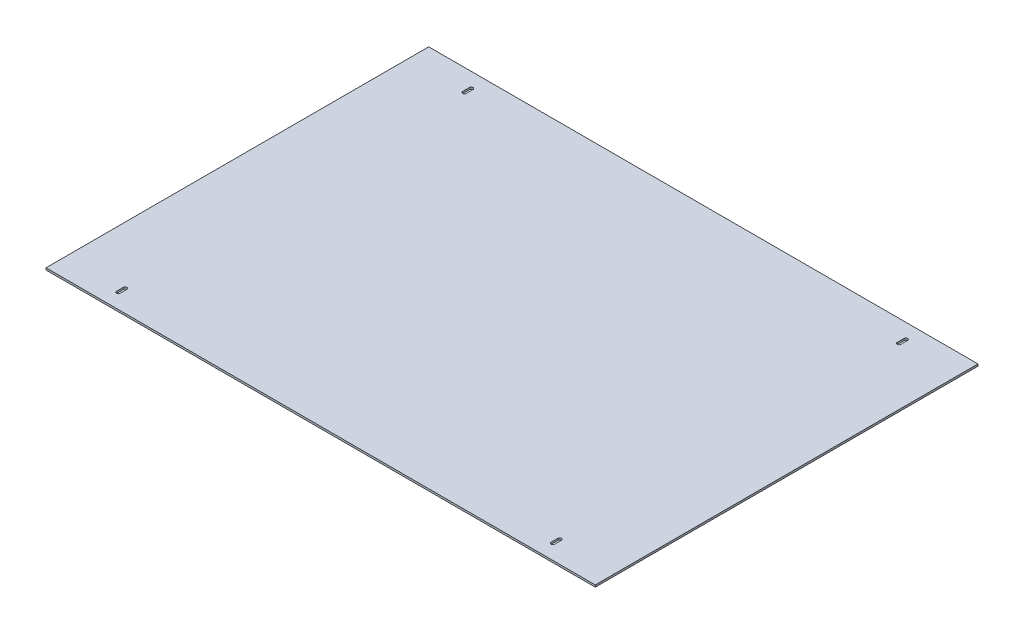
ISO-10303-21;
HEADER;
FILE_DESCRIPTION(('STEP AP214'),'2;1');
FILE_NAME('part.step','',(''),(''),'','','');
FILE_SCHEMA(('AUTOMOTIVE_DESIGN { 1 0 10303 214 1 1 1 1 }'));
ENDSEC;
DATA;
#1=APPLICATION_CONTEXT('core data for automotive mechanical design processes');
#2=APPLICATION_PROTOCOL_DEFINITION('international standard','automotive_design',2000,#1);
#3=PRODUCT_CONTEXT('',#1,'mechanical');
#4=PRODUCT('Part','Part','',(#3));
#5=PRODUCT_RELATED_PRODUCT_CATEGORY('part','',(#4));
#6=PRODUCT_DEFINITION_FORMATION('','',#4);
#7=PRODUCT_DEFINITION_CONTEXT('part definition',#1,'design');
#8=PRODUCT_DEFINITION('design','',#6,#7);
#9=PRODUCT_DEFINITION_SHAPE('','',#8);
#10=(LENGTH_UNIT() NAMED_UNIT(*) SI_UNIT(.MILLI.,.METRE.));
#11=(NAMED_UNIT(*) PLANE_ANGLE_UNIT() SI_UNIT($,.RADIAN.));
#12=(NAMED_UNIT(*) SI_UNIT($,.STERADIAN.) SOLID_ANGLE_UNIT());
#13=UNCERTAINTY_MEASURE_WITH_UNIT(LENGTH_MEASURE(1.E-05),#10,'distance_accuracy_value','');
#14=(GEOMETRIC_REPRESENTATION_CONTEXT(3) GLOBAL_UNCERTAINTY_ASSIGNED_CONTEXT((#13)) GLOBAL_UNIT_ASSIGNED_CONTEXT((#10,
#11,#12)) REPRESENTATION_CONTEXT('',''));
#15=CARTESIAN_POINT('',(0.,0.,0.));
#16=DIRECTION('',(0.,0.,1.));
#17=DIRECTION('',(1.,0.,0.));
#18=AXIS2_PLACEMENT_3D('',#15,#16,#17);
#19=CARTESIAN_POINT('',(353.1235,2.54,246.0625));
#20=DIRECTION('',(-1.,0.,0.));
#21=DIRECTION('',(0.,0.,1.));
#22=AXIS2_PLACEMENT_3D('',#19,#20,#21);
#23=PLANE('',#22);
#24=DIRECTION('',(0.,0.,-1.));
#25=VECTOR('',#24,1.);
#26=CARTESIAN_POINT('',(353.1235,0.,246.0625));
#27=LINE('',#26,#25);
#28=CARTESIAN_POINT('',(353.1235,0.,246.0625));
#29=VERTEX_POINT('',#28);
#30=CARTESIAN_POINT('',(353.1235,0.,-246.0625));
#31=VERTEX_POINT('',#30);
#32=EDGE_CURVE('E295',#29,#31,#27,.T.);
#33=ORIENTED_EDGE('',*,*,#32,.T.);
#34=DIRECTION('',(0.,-1.,0.));
#35=VECTOR('',#34,1.);
#36=CARTESIAN_POINT('',(353.1235,2.54,-246.0625));
#37=LINE('',#36,#35);
#38=CARTESIAN_POINT('',(353.1235,2.54,-246.0625));
#39=VERTEX_POINT('',#38);
#40=EDGE_CURVE('E11',#39,#31,#37,.T.);
#41=ORIENTED_EDGE('',*,*,#40,.F.);
#42=DIRECTION('',(0.,0.,-1.));
#43=VECTOR('',#42,1.);
#44=CARTESIAN_POINT('',(353.1235,2.54,246.0625));
#45=LINE('',#44,#43);
#46=CARTESIAN_POINT('',(353.1235,2.54,246.0625));
#47=VERTEX_POINT('',#46);
#48=EDGE_CURVE('E302',#47,#39,#45,.T.);
#49=ORIENTED_EDGE('',*,*,#48,.F.);
#50=DIRECTION('',(0.,-1.,0.));
#51=VECTOR('',#50,1.);
#52=CARTESIAN_POINT('',(353.1235,2.54,246.0625));
#53=LINE('',#52,#51);
#54=EDGE_CURVE('E312',#47,#29,#53,.T.);
#55=ORIENTED_EDGE('',*,*,#54,.T.);
#56=EDGE_LOOP('',(#33,#41,#49,#55));
#57=FACE_BOUND('',#56,.T.);
#58=ADVANCED_FACE('F33',(#57),#23,.F.);
#59=CARTESIAN_POINT('',(-353.1235,2.54,-246.0625));
#60=DIRECTION('',(0.,0.,1.));
#61=DIRECTION('',(1.,0.,0.));
#62=AXIS2_PLACEMENT_3D('',#59,#60,#61);
#63=PLANE('',#62);
#64=DIRECTION('',(-1.,0.,0.));
#65=VECTOR('',#64,1.);
#66=CARTESIAN_POINT('',(-353.1235,0.,-246.0625));
#67=LINE('',#66,#65);
#68=CARTESIAN_POINT('',(-353.1235,0.,-246.0625));
#69=VERTEX_POINT('',#68);
#70=EDGE_CURVE('E315',#31,#69,#67,.T.);
#71=ORIENTED_EDGE('',*,*,#70,.T.);
#72=DIRECTION('',(0.,-1.,0.));
#73=VECTOR('',#72,1.);
#74=CARTESIAN_POINT('',(-353.1235,2.54,-246.0625));
#75=LINE('',#74,#73);
#76=CARTESIAN_POINT('',(-353.1235,2.54,-246.0625));
#77=VERTEX_POINT('',#76);
#78=EDGE_CURVE('E40',#77,#69,#75,.T.);
#79=ORIENTED_EDGE('',*,*,#78,.F.);
#80=DIRECTION('',(-1.,0.,0.));
#81=VECTOR('',#80,1.);
#82=CARTESIAN_POINT('',(-353.1235,2.54,-246.0625));
#83=LINE('',#82,#81);
#84=EDGE_CURVE('E305',#39,#77,#83,.T.);
#85=ORIENTED_EDGE('',*,*,#84,.F.);
#86=ORIENTED_EDGE('',*,*,#40,.T.);
#87=EDGE_LOOP('',(#71,#79,#85,#86));
#88=FACE_BOUND('',#87,.T.);
#89=ADVANCED_FACE('F344',(#88),#63,.F.);
#90=CARTESIAN_POINT('',(-353.1235,2.54,246.0625));
#91=DIRECTION('',(1.,0.,0.));
#92=DIRECTION('',(0.,0.,-1.));
#93=AXIS2_PLACEMENT_3D('',#90,#91,#92);
#94=PLANE('',#93);
#95=DIRECTION('',(0.,0.,1.));
#96=VECTOR('',#95,1.);
#97=CARTESIAN_POINT('',(-353.1235,0.,246.0625));
#98=LINE('',#97,#96);
#99=CARTESIAN_POINT('',(-353.1235,0.,246.0625));
#100=VERTEX_POINT('',#99);
#101=EDGE_CURVE('E317',#69,#100,#98,.T.);
#102=ORIENTED_EDGE('',*,*,#101,.T.);
#103=DIRECTION('',(0.,-1.,0.));
#104=VECTOR('',#103,1.);
#105=CARTESIAN_POINT('',(-353.1235,2.54,246.0625));
#106=LINE('',#105,#104);
#107=CARTESIAN_POINT('',(-353.1235,2.54,246.0625));
#108=VERTEX_POINT('',#107);
#109=EDGE_CURVE('E322',#108,#100,#106,.T.);
#110=ORIENTED_EDGE('',*,*,#109,.F.);
#111=DIRECTION('',(0.,0.,1.));
#112=VECTOR('',#111,1.);
#113=CARTESIAN_POINT('',(-353.1235,2.54,246.0625));
#114=LINE('',#113,#112);
#115=EDGE_CURVE('E308',#77,#108,#114,.T.);
#116=ORIENTED_EDGE('',*,*,#115,.F.);
#117=ORIENTED_EDGE('',*,*,#78,.T.);
#118=EDGE_LOOP('',(#102,#110,#116,#117));
#119=FACE_BOUND('',#118,.T.);
#120=ADVANCED_FACE('F329',(#119),#94,.F.);
#121=CARTESIAN_POINT('',(-353.1235,2.54,246.0625));
#122=DIRECTION('',(0.,0.,-1.));
#123=DIRECTION('',(-1.,0.,0.));
#124=AXIS2_PLACEMENT_3D('',#121,#122,#123);
#125=PLANE('',#124);
#126=DIRECTION('',(1.,0.,0.));
#127=VECTOR('',#126,1.);
#128=CARTESIAN_POINT('',(-353.1235,0.,246.0625));
#129=LINE('',#128,#127);
#130=EDGE_CURVE('E306',#100,#29,#129,.T.);
#131=ORIENTED_EDGE('',*,*,#130,.T.);
#132=ORIENTED_EDGE('',*,*,#54,.F.);
#133=DIRECTION('',(1.,0.,0.));
#134=VECTOR('',#133,1.);
#135=CARTESIAN_POINT('',(-353.1235,2.54,246.0625));
#136=LINE('',#135,#134);
#137=EDGE_CURVE('E310',#108,#47,#136,.T.);
#138=ORIENTED_EDGE('',*,*,#137,.F.);
#139=ORIENTED_EDGE('',*,*,#109,.T.);
#140=EDGE_LOOP('',(#131,#132,#138,#139));
#141=FACE_BOUND('',#140,.T.);
#142=ADVANCED_FACE('F337',(#141),#125,.F.);
#143=CARTESIAN_POINT('',(0.,2.54,0.));
#144=DIRECTION('',(0.,-1.,0.));
#145=DIRECTION('',(0.,0.,-1.));
#146=AXIS2_PLACEMENT_3D('',#143,#144,#145);
#147=PLANE('',#146);
#148=DIRECTION('',(0.,0.,1.));
#149=VECTOR('',#148,1.);
#150=CARTESIAN_POINT('',(-281.6479,2.54,218.1225));
#151=LINE('',#150,#149);
#152=CARTESIAN_POINT('',(-281.6479,2.54,218.1225));
#153=VERTEX_POINT('',#152);
#154=CARTESIAN_POINT('',(-281.6479,2.54,227.0125));
#155=VERTEX_POINT('',#154);
#156=EDGE_CURVE('E196',#153,#155,#151,.T.);
#157=ORIENTED_EDGE('',*,*,#156,.F.);
#158=CARTESIAN_POINT('',(-279.4,2.54,218.1225));
#159=DIRECTION('',(0.,1.,0.));
#160=DIRECTION('',(0.,0.,1.));
#161=AXIS2_PLACEMENT_3D('',#158,#159,#160);
#162=CIRCLE('',#161,2.24789999999997);
#163=CARTESIAN_POINT('',(-277.1521,2.54,218.1225));
#164=VERTEX_POINT('',#163);
#165=EDGE_CURVE('E47',#164,#153,#162,.T.);
#166=ORIENTED_EDGE('',*,*,#165,.F.);
#167=DIRECTION('',(0.,0.,-1.));
#168=VECTOR('',#167,1.);
#169=CARTESIAN_POINT('',(-277.1521,2.54,218.1225));
#170=LINE('',#169,#168);
#171=CARTESIAN_POINT('',(-277.1521,2.54,227.0125));
#172=VERTEX_POINT('',#171);
#173=EDGE_CURVE('E187',#172,#164,#170,.T.);
#174=ORIENTED_EDGE('',*,*,#173,.F.);
#175=CARTESIAN_POINT('',(-279.4,2.54,227.0125));
#176=DIRECTION('',(0.,1.,0.));
#177=DIRECTION('',(0.,0.,1.));
#178=AXIS2_PLACEMENT_3D('',#175,#176,#177);
#179=CIRCLE('',#178,2.24789999999997);
#180=EDGE_CURVE('E190',#155,#172,#179,.T.);
#181=ORIENTED_EDGE('',*,*,#180,.F.);
#182=EDGE_LOOP('',(#157,#166,#174,#181));
#183=FACE_BOUND('',#182,.T.);
#184=DIRECTION('',(0.,0.,1.));
#185=VECTOR('',#184,1.);
#186=CARTESIAN_POINT('',(277.1521,2.54,218.1225));
#187=LINE('',#186,#185);
#188=CARTESIAN_POINT('',(277.1521,2.54,218.1225));
#189=VERTEX_POINT('',#188);
#190=CARTESIAN_POINT('',(277.1521,2.54,227.0125));
#191=VERTEX_POINT('',#190);
#192=EDGE_CURVE('E221',#189,#191,#187,.T.);
#193=ORIENTED_EDGE('',*,*,#192,.F.);
#194=CARTESIAN_POINT('',(279.4,2.54,218.1225));
#195=DIRECTION('',(0.,1.,0.));
#196=DIRECTION('',(0.,0.,-1.));
#197=AXIS2_PLACEMENT_3D('',#194,#195,#196);
#198=CIRCLE('',#197,2.24789999999997);
#199=CARTESIAN_POINT('',(281.6479,2.54,218.1225));
#200=VERTEX_POINT('',#199);
#201=EDGE_CURVE('E202',#200,#189,#198,.T.);
#202=ORIENTED_EDGE('',*,*,#201,.F.);
#203=DIRECTION('',(0.,0.,-1.));
#204=VECTOR('',#203,1.);
#205=CARTESIAN_POINT('',(281.6479,2.54,218.1225));
#206=LINE('',#205,#204);
#207=CARTESIAN_POINT('',(281.6479,2.54,227.0125));
#208=VERTEX_POINT('',#207);
#209=EDGE_CURVE('E210',#208,#200,#206,.T.);
#210=ORIENTED_EDGE('',*,*,#209,.F.);
#211=CARTESIAN_POINT('',(279.4,2.54,227.0125));
#212=DIRECTION('',(0.,1.,0.));
#213=DIRECTION('',(0.,0.,-1.));
#214=AXIS2_PLACEMENT_3D('',#211,#212,#213);
#215=CIRCLE('',#214,2.24789999999997);
#216=EDGE_CURVE('E224',#191,#208,#215,.T.);
#217=ORIENTED_EDGE('',*,*,#216,.F.);
#218=EDGE_LOOP('',(#193,#202,#210,#217));
#219=FACE_BOUND('',#218,.T.);
#220=DIRECTION('',(0.,0.,-1.));
#221=VECTOR('',#220,1.);
#222=CARTESIAN_POINT('',(-277.1521,2.54,-218.1225));
#223=LINE('',#222,#221);
#224=CARTESIAN_POINT('',(-277.1521,2.54,-218.1225));
#225=VERTEX_POINT('',#224);
#226=CARTESIAN_POINT('',(-277.1521,2.54,-227.0125));
#227=VERTEX_POINT('',#226);
#228=EDGE_CURVE('E253',#225,#227,#223,.T.);
#229=ORIENTED_EDGE('',*,*,#228,.F.);
#230=CARTESIAN_POINT('',(-279.4,2.54,-218.1225));
#231=DIRECTION('',(0.,1.,0.));
#232=DIRECTION('',(0.,0.,-1.));
#233=AXIS2_PLACEMENT_3D('',#230,#231,#232);
#234=CIRCLE('',#233,2.24789999999997);
#235=CARTESIAN_POINT('',(-281.6479,2.54,-218.1225));
#236=VERTEX_POINT('',#235);
#237=EDGE_CURVE('E231',#236,#225,#234,.T.);
#238=ORIENTED_EDGE('',*,*,#237,.F.);
#239=DIRECTION('',(0.,0.,1.));
#240=VECTOR('',#239,1.);
#241=CARTESIAN_POINT('',(-281.6479,2.54,-218.1225));
#242=LINE('',#241,#240);
#243=CARTESIAN_POINT('',(-281.6479,2.54,-227.0125));
#244=VERTEX_POINT('',#243);
#245=EDGE_CURVE('E242',#244,#236,#242,.T.);
#246=ORIENTED_EDGE('',*,*,#245,.F.);
#247=CARTESIAN_POINT('',(-279.4,2.54,-227.0125));
#248=DIRECTION('',(0.,1.,0.));
#249=DIRECTION('',(0.,0.,-1.));
#250=AXIS2_PLACEMENT_3D('',#247,#248,#249);
#251=CIRCLE('',#250,2.24789999999997);
#252=EDGE_CURVE('E256',#227,#244,#251,.T.);
#253=ORIENTED_EDGE('',*,*,#252,.F.);
#254=EDGE_LOOP('',(#229,#238,#246,#253));
#255=FACE_BOUND('',#254,.T.);
#256=DIRECTION('',(0.,0.,-1.));
#257=VECTOR('',#256,1.);
#258=CARTESIAN_POINT('',(281.6479,2.54,-218.1225));
#259=LINE('',#258,#257);
#260=CARTESIAN_POINT('',(281.6479,2.54,-218.1225));
#261=VERTEX_POINT('',#260);
#262=CARTESIAN_POINT('',(281.6479,2.54,-227.0125));
#263=VERTEX_POINT('',#262);
#264=EDGE_CURVE('E285',#261,#263,#259,.T.);
#265=ORIENTED_EDGE('',*,*,#264,.F.);
#266=CARTESIAN_POINT('',(279.4,2.54,-218.1225));
#267=DIRECTION('',(0.,1.,0.));
#268=DIRECTION('',(0.,0.,1.));
#269=AXIS2_PLACEMENT_3D('',#266,#267,#268);
#270=CIRCLE('',#269,2.24789999999997);
#271=CARTESIAN_POINT('',(277.1521,2.54,-218.1225));
#272=VERTEX_POINT('',#271);
#273=EDGE_CURVE('E263',#272,#261,#270,.T.);
#274=ORIENTED_EDGE('',*,*,#273,.F.);
#275=DIRECTION('',(0.,0.,1.));
#276=VECTOR('',#275,1.);
#277=CARTESIAN_POINT('',(277.1521,2.54,-218.1225));
#278=LINE('',#277,#276);
#279=CARTESIAN_POINT('',(277.1521,2.54,-227.0125));
#280=VERTEX_POINT('',#279);
#281=EDGE_CURVE('E274',#280,#272,#278,.T.);
#282=ORIENTED_EDGE('',*,*,#281,.F.);
#283=CARTESIAN_POINT('',(279.4,2.54,-227.0125));
#284=DIRECTION('',(0.,1.,0.));
#285=DIRECTION('',(0.,0.,1.));
#286=AXIS2_PLACEMENT_3D('',#283,#284,#285);
#287=CIRCLE('',#286,2.24789999999997);
#288=EDGE_CURVE('E288',#263,#280,#287,.T.);
#289=ORIENTED_EDGE('',*,*,#288,.F.);
#290=EDGE_LOOP('',(#265,#274,#282,#289));
#291=FACE_BOUND('',#290,.T.);
#292=ORIENTED_EDGE('',*,*,#48,.T.);
#293=ORIENTED_EDGE('',*,*,#84,.T.);
#294=ORIENTED_EDGE('',*,*,#115,.T.);
#295=ORIENTED_EDGE('',*,*,#137,.T.);
#296=EDGE_LOOP('',(#292,#293,#294,#295));
#297=FACE_BOUND('',#296,.T.);
#298=ADVANCED_FACE('F343',(#183,#219,#255,#291,#297),#147,.F.);
#299=CARTESIAN_POINT('',(0.,0.,0.));
#300=DIRECTION('',(0.,-1.,0.));
#301=DIRECTION('',(0.,0.,-1.));
#302=AXIS2_PLACEMENT_3D('',#299,#300,#301);
#303=PLANE('',#302);
#304=CARTESIAN_POINT('',(-279.4,0.,218.1225));
#305=DIRECTION('',(0.,1.,0.));
#306=DIRECTION('',(0.,0.,1.));
#307=AXIS2_PLACEMENT_3D('',#304,#305,#306);
#308=CIRCLE('',#307,2.24789999999997);
#309=CARTESIAN_POINT('',(-277.1521,0.,218.1225));
#310=VERTEX_POINT('',#309);
#311=CARTESIAN_POINT('',(-281.6479,0.,218.1225));
#312=VERTEX_POINT('',#311);
#313=EDGE_CURVE('E171',#310,#312,#308,.T.);
#314=ORIENTED_EDGE('',*,*,#313,.T.);
#315=DIRECTION('',(0.,0.,1.));
#316=VECTOR('',#315,1.);
#317=CARTESIAN_POINT('',(-281.6479,0.,218.1225));
#318=LINE('',#317,#316);
#319=CARTESIAN_POINT('',(-281.6479,0.,227.0125));
#320=VERTEX_POINT('',#319);
#321=EDGE_CURVE('E180',#312,#320,#318,.T.);
#322=ORIENTED_EDGE('',*,*,#321,.T.);
#323=CARTESIAN_POINT('',(-279.4,0.,227.0125));
#324=DIRECTION('',(0.,1.,0.));
#325=DIRECTION('',(0.,0.,1.));
#326=AXIS2_PLACEMENT_3D('',#323,#324,#325);
#327=CIRCLE('',#326,2.24789999999997);
#328=CARTESIAN_POINT('',(-277.1521,0.,227.0125));
#329=VERTEX_POINT('',#328);
#330=EDGE_CURVE('E55',#320,#329,#327,.T.);
#331=ORIENTED_EDGE('',*,*,#330,.T.);
#332=DIRECTION('',(0.,0.,-1.));
#333=VECTOR('',#332,1.);
#334=CARTESIAN_POINT('',(-277.1521,0.,218.1225));
#335=LINE('',#334,#333);
#336=EDGE_CURVE('E177',#329,#310,#335,.T.);
#337=ORIENTED_EDGE('',*,*,#336,.T.);
#338=EDGE_LOOP('',(#314,#322,#331,#337));
#339=FACE_BOUND('',#338,.T.);
#340=CARTESIAN_POINT('',(279.4,0.,218.1225));
#341=DIRECTION('',(0.,1.,0.));
#342=DIRECTION('',(0.,0.,-1.));
#343=AXIS2_PLACEMENT_3D('',#340,#341,#342);
#344=CIRCLE('',#343,2.24789999999997);
#345=CARTESIAN_POINT('',(281.6479,0.,218.1225));
#346=VERTEX_POINT('',#345);
#347=CARTESIAN_POINT('',(277.1521,0.,218.1225));
#348=VERTEX_POINT('',#347);
#349=EDGE_CURVE('E206',#346,#348,#344,.T.);
#350=ORIENTED_EDGE('',*,*,#349,.T.);
#351=DIRECTION('',(0.,0.,1.));
#352=VECTOR('',#351,1.);
#353=CARTESIAN_POINT('',(277.1521,0.,218.1225));
#354=LINE('',#353,#352);
#355=CARTESIAN_POINT('',(277.1521,0.,227.0125));
#356=VERTEX_POINT('',#355);
#357=EDGE_CURVE('E209',#348,#356,#354,.T.);
#358=ORIENTED_EDGE('',*,*,#357,.T.);
#359=CARTESIAN_POINT('',(279.4,0.,227.0125));
#360=DIRECTION('',(0.,1.,0.));
#361=DIRECTION('',(0.,0.,-1.));
#362=AXIS2_PLACEMENT_3D('',#359,#360,#361);
#363=CIRCLE('',#362,2.24789999999997);
#364=CARTESIAN_POINT('',(281.6479,0.,227.0125));
#365=VERTEX_POINT('',#364);
#366=EDGE_CURVE('E213',#356,#365,#363,.T.);
#367=ORIENTED_EDGE('',*,*,#366,.T.);
#368=DIRECTION('',(0.,0.,-1.));
#369=VECTOR('',#368,1.);
#370=CARTESIAN_POINT('',(281.6479,0.,218.1225));
#371=LINE('',#370,#369);
#372=EDGE_CURVE('E216',#365,#346,#371,.T.);
#373=ORIENTED_EDGE('',*,*,#372,.T.);
#374=EDGE_LOOP('',(#350,#358,#367,#373));
#375=FACE_BOUND('',#374,.T.);
#376=CARTESIAN_POINT('',(-279.4,0.,-218.1225));
#377=DIRECTION('',(0.,1.,0.));
#378=DIRECTION('',(0.,0.,-1.));
#379=AXIS2_PLACEMENT_3D('',#376,#377,#378);
#380=CIRCLE('',#379,2.24789999999997);
#381=CARTESIAN_POINT('',(-281.6479,0.,-218.1225));
#382=VERTEX_POINT('',#381);
#383=CARTESIAN_POINT('',(-277.1521,0.,-218.1225));
#384=VERTEX_POINT('',#383);
#385=EDGE_CURVE('E238',#382,#384,#380,.T.);
#386=ORIENTED_EDGE('',*,*,#385,.T.);
#387=DIRECTION('',(0.,0.,-1.));
#388=VECTOR('',#387,1.);
#389=CARTESIAN_POINT('',(-277.1521,0.,-218.1225));
#390=LINE('',#389,#388);
#391=CARTESIAN_POINT('',(-277.1521,0.,-227.0125));
#392=VERTEX_POINT('',#391);
#393=EDGE_CURVE('E241',#384,#392,#390,.T.);
#394=ORIENTED_EDGE('',*,*,#393,.T.);
#395=CARTESIAN_POINT('',(-279.4,0.,-227.0125));
#396=DIRECTION('',(0.,1.,0.));
#397=DIRECTION('',(0.,0.,-1.));
#398=AXIS2_PLACEMENT_3D('',#395,#396,#397);
#399=CIRCLE('',#398,2.24789999999997);
#400=CARTESIAN_POINT('',(-281.6479,0.,-227.0125));
#401=VERTEX_POINT('',#400);
#402=EDGE_CURVE('E245',#392,#401,#399,.T.);
#403=ORIENTED_EDGE('',*,*,#402,.T.);
#404=DIRECTION('',(0.,0.,1.));
#405=VECTOR('',#404,1.);
#406=CARTESIAN_POINT('',(-281.6479,0.,-218.1225));
#407=LINE('',#406,#405);
#408=EDGE_CURVE('E248',#401,#382,#407,.T.);
#409=ORIENTED_EDGE('',*,*,#408,.T.);
#410=EDGE_LOOP('',(#386,#394,#403,#409));
#411=FACE_BOUND('',#410,.T.);
#412=CARTESIAN_POINT('',(279.4,0.,-218.1225));
#413=DIRECTION('',(0.,1.,0.));
#414=DIRECTION('',(0.,0.,1.));
#415=AXIS2_PLACEMENT_3D('',#412,#413,#414);
#416=CIRCLE('',#415,2.24789999999997);
#417=CARTESIAN_POINT('',(277.1521,0.,-218.1225));
#418=VERTEX_POINT('',#417);
#419=CARTESIAN_POINT('',(281.6479,0.,-218.1225));
#420=VERTEX_POINT('',#419);
#421=EDGE_CURVE('E270',#418,#420,#416,.T.);
#422=ORIENTED_EDGE('',*,*,#421,.T.);
#423=DIRECTION('',(0.,0.,-1.));
#424=VECTOR('',#423,1.);
#425=CARTESIAN_POINT('',(281.6479,0.,-218.1225));
#426=LINE('',#425,#424);
#427=CARTESIAN_POINT('',(281.6479,0.,-227.0125));
#428=VERTEX_POINT('',#427);
#429=EDGE_CURVE('E273',#420,#428,#426,.T.);
#430=ORIENTED_EDGE('',*,*,#429,.T.);
#431=CARTESIAN_POINT('',(279.4,0.,-227.0125));
#432=DIRECTION('',(0.,1.,0.));
#433=DIRECTION('',(0.,0.,1.));
#434=AXIS2_PLACEMENT_3D('',#431,#432,#433);
#435=CIRCLE('',#434,2.24789999999997);
#436=CARTESIAN_POINT('',(277.1521,0.,-227.0125));
#437=VERTEX_POINT('',#436);
#438=EDGE_CURVE('E277',#428,#437,#435,.T.);
#439=ORIENTED_EDGE('',*,*,#438,.T.);
#440=DIRECTION('',(0.,0.,1.));
#441=VECTOR('',#440,1.);
#442=CARTESIAN_POINT('',(277.1521,0.,-218.1225));
#443=LINE('',#442,#441);
#444=EDGE_CURVE('E280',#437,#418,#443,.T.);
#445=ORIENTED_EDGE('',*,*,#444,.T.);
#446=EDGE_LOOP('',(#422,#430,#439,#445));
#447=FACE_BOUND('',#446,.T.);
#448=ORIENTED_EDGE('',*,*,#32,.F.);
#449=ORIENTED_EDGE('',*,*,#130,.F.);
#450=ORIENTED_EDGE('',*,*,#101,.F.);
#451=ORIENTED_EDGE('',*,*,#70,.F.);
#452=EDGE_LOOP('',(#448,#449,#450,#451));
#453=FACE_BOUND('',#452,.T.);
#454=ADVANCED_FACE('F184',(#339,#375,#411,#447,#453),#303,.T.);
#455=CARTESIAN_POINT('',(279.4,0.,-218.1225));
#456=DIRECTION('',(0.,1.,0.));
#457=DIRECTION('',(0.,0.,1.));
#458=AXIS2_PLACEMENT_3D('',#455,#456,#457);
#459=CYLINDRICAL_SURFACE('',#458,2.24789999999997);
#460=ORIENTED_EDGE('',*,*,#273,.T.);
#461=DIRECTION('',(0.,1.,0.));
#462=VECTOR('',#461,1.);
#463=CARTESIAN_POINT('',(281.6479,0.,-218.1225));
#464=LINE('',#463,#462);
#465=EDGE_CURVE('E283',#420,#261,#464,.T.);
#466=ORIENTED_EDGE('',*,*,#465,.F.);
#467=ORIENTED_EDGE('',*,*,#421,.F.);
#468=DIRECTION('',(0.,1.,0.));
#469=VECTOR('',#468,1.);
#470=CARTESIAN_POINT('',(277.1521,0.,-218.1225));
#471=LINE('',#470,#469);
#472=EDGE_CURVE('E293',#418,#272,#471,.T.);
#473=ORIENTED_EDGE('',*,*,#472,.T.);
#474=EDGE_LOOP('',(#460,#466,#467,#473));
#475=FACE_BOUND('',#474,.T.);
#476=ADVANCED_FACE('F356',(#475),#459,.F.);
#477=CARTESIAN_POINT('',(277.1521,0.,-218.1225));
#478=DIRECTION('',(-1.,0.,0.));
#479=DIRECTION('',(0.,0.,1.));
#480=AXIS2_PLACEMENT_3D('',#477,#478,#479);
#481=PLANE('',#480);
#482=ORIENTED_EDGE('',*,*,#281,.T.);
#483=ORIENTED_EDGE('',*,*,#472,.F.);
#484=ORIENTED_EDGE('',*,*,#444,.F.);
#485=DIRECTION('',(0.,1.,0.));
#486=VECTOR('',#485,1.);
#487=CARTESIAN_POINT('',(277.1521,0.,-227.0125));
#488=LINE('',#487,#486);
#489=EDGE_CURVE('E296',#437,#280,#488,.T.);
#490=ORIENTED_EDGE('',*,*,#489,.T.);
#491=EDGE_LOOP('',(#482,#483,#484,#490));
#492=FACE_BOUND('',#491,.T.);
#493=ADVANCED_FACE('F362',(#492),#481,.F.);
#494=CARTESIAN_POINT('',(279.4,0.,-227.0125));
#495=DIRECTION('',(0.,1.,0.));
#496=DIRECTION('',(0.,0.,1.));
#497=AXIS2_PLACEMENT_3D('',#494,#495,#496);
#498=CYLINDRICAL_SURFACE('',#497,2.24789999999997);
#499=ORIENTED_EDGE('',*,*,#288,.T.);
#500=ORIENTED_EDGE('',*,*,#489,.F.);
#501=ORIENTED_EDGE('',*,*,#438,.F.);
#502=DIRECTION('',(0.,1.,0.));
#503=VECTOR('',#502,1.);
#504=CARTESIAN_POINT('',(281.6479,0.,-227.0125));
#505=LINE('',#504,#503);
#506=EDGE_CURVE('E298',#428,#263,#505,.T.);
#507=ORIENTED_EDGE('',*,*,#506,.T.);
#508=EDGE_LOOP('',(#499,#500,#501,#507));
#509=FACE_BOUND('',#508,.T.);
#510=ADVANCED_FACE('F368',(#509),#498,.F.);
#511=CARTESIAN_POINT('',(281.6479,0.,-218.1225));
#512=DIRECTION('',(1.,0.,0.));
#513=DIRECTION('',(0.,0.,-1.));
#514=AXIS2_PLACEMENT_3D('',#511,#512,#513);
#515=PLANE('',#514);
#516=ORIENTED_EDGE('',*,*,#264,.T.);
#517=ORIENTED_EDGE('',*,*,#506,.F.);
#518=ORIENTED_EDGE('',*,*,#429,.F.);
#519=ORIENTED_EDGE('',*,*,#465,.T.);
#520=EDGE_LOOP('',(#516,#517,#518,#519));
#521=FACE_BOUND('',#520,.T.);
#522=ADVANCED_FACE('F364',(#521),#515,.F.);
#523=CARTESIAN_POINT('',(-279.4,0.,-218.1225));
#524=DIRECTION('',(0.,1.,0.));
#525=DIRECTION('',(0.,0.,1.));
#526=AXIS2_PLACEMENT_3D('',#523,#524,#525);
#527=CYLINDRICAL_SURFACE('',#526,2.24789999999997);
#528=ORIENTED_EDGE('',*,*,#237,.T.);
#529=DIRECTION('',(0.,1.,0.));
#530=VECTOR('',#529,1.);
#531=CARTESIAN_POINT('',(-277.1521,0.,-218.1225));
#532=LINE('',#531,#530);
#533=EDGE_CURVE('E251',#384,#225,#532,.T.);
#534=ORIENTED_EDGE('',*,*,#533,.F.);
#535=ORIENTED_EDGE('',*,*,#385,.F.);
#536=DIRECTION('',(0.,1.,0.));
#537=VECTOR('',#536,1.);
#538=CARTESIAN_POINT('',(-281.6479,0.,-218.1225));
#539=LINE('',#538,#537);
#540=EDGE_CURVE('E261',#382,#236,#539,.T.);
#541=ORIENTED_EDGE('',*,*,#540,.T.);
#542=EDGE_LOOP('',(#528,#534,#535,#541));
#543=FACE_BOUND('',#542,.T.);
#544=ADVANCED_FACE('F367',(#543),#527,.F.);
#545=CARTESIAN_POINT('',(-281.6479,0.,-218.1225));
#546=DIRECTION('',(-1.,0.,0.));
#547=DIRECTION('',(0.,0.,1.));
#548=AXIS2_PLACEMENT_3D('',#545,#546,#547);
#549=PLANE('',#548);
#550=ORIENTED_EDGE('',*,*,#245,.T.);
#551=ORIENTED_EDGE('',*,*,#540,.F.);
#552=ORIENTED_EDGE('',*,*,#408,.F.);
#553=DIRECTION('',(0.,1.,0.));
#554=VECTOR('',#553,1.);
#555=CARTESIAN_POINT('',(-281.6479,0.,-227.0125));
#556=LINE('',#555,#554);
#557=EDGE_CURVE('E264',#401,#244,#556,.T.);
#558=ORIENTED_EDGE('',*,*,#557,.T.);
#559=EDGE_LOOP('',(#550,#551,#552,#558));
#560=FACE_BOUND('',#559,.T.);
#561=ADVANCED_FACE('F378',(#560),#549,.F.);
#562=CARTESIAN_POINT('',(-279.4,0.,-227.0125));
#563=DIRECTION('',(0.,1.,0.));
#564=DIRECTION('',(0.,0.,1.));
#565=AXIS2_PLACEMENT_3D('',#562,#563,#564);
#566=CYLINDRICAL_SURFACE('',#565,2.24789999999997);
#567=ORIENTED_EDGE('',*,*,#252,.T.);
#568=ORIENTED_EDGE('',*,*,#557,.F.);
#569=ORIENTED_EDGE('',*,*,#402,.F.);
#570=DIRECTION('',(0.,1.,0.));
#571=VECTOR('',#570,1.);
#572=CARTESIAN_POINT('',(-277.1521,0.,-227.0125));
#573=LINE('',#572,#571);
#574=EDGE_CURVE('E266',#392,#227,#573,.T.);
#575=ORIENTED_EDGE('',*,*,#574,.T.);
#576=EDGE_LOOP('',(#567,#568,#569,#575));
#577=FACE_BOUND('',#576,.T.);
#578=ADVANCED_FACE('F384',(#577),#566,.F.);
#579=CARTESIAN_POINT('',(-277.1521,0.,-218.1225));
#580=DIRECTION('',(1.,0.,0.));
#581=DIRECTION('',(0.,0.,-1.));
#582=AXIS2_PLACEMENT_3D('',#579,#580,#581);
#583=PLANE('',#582);
#584=ORIENTED_EDGE('',*,*,#228,.T.);
#585=ORIENTED_EDGE('',*,*,#574,.F.);
#586=ORIENTED_EDGE('',*,*,#393,.F.);
#587=ORIENTED_EDGE('',*,*,#533,.T.);
#588=EDGE_LOOP('',(#584,#585,#586,#587));
#589=FACE_BOUND('',#588,.T.);
#590=ADVANCED_FACE('F380',(#589),#583,.F.);
#591=CARTESIAN_POINT('',(279.4,0.,218.1225));
#592=DIRECTION('',(0.,1.,0.));
#593=DIRECTION('',(0.,0.,1.));
#594=AXIS2_PLACEMENT_3D('',#591,#592,#593);
#595=CYLINDRICAL_SURFACE('',#594,2.24789999999997);
#596=ORIENTED_EDGE('',*,*,#201,.T.);
#597=DIRECTION('',(0.,1.,0.));
#598=VECTOR('',#597,1.);
#599=CARTESIAN_POINT('',(277.1521,0.,218.1225));
#600=LINE('',#599,#598);
#601=EDGE_CURVE('E219',#348,#189,#600,.T.);
#602=ORIENTED_EDGE('',*,*,#601,.F.);
#603=ORIENTED_EDGE('',*,*,#349,.F.);
#604=DIRECTION('',(0.,1.,0.));
#605=VECTOR('',#604,1.);
#606=CARTESIAN_POINT('',(281.6479,0.,218.1225));
#607=LINE('',#606,#605);
#608=EDGE_CURVE('E229',#346,#200,#607,.T.);
#609=ORIENTED_EDGE('',*,*,#608,.T.);
#610=EDGE_LOOP('',(#596,#602,#603,#609));
#611=FACE_BOUND('',#610,.T.);
#612=ADVANCED_FACE('F383',(#611),#595,.F.);
#613=CARTESIAN_POINT('',(281.6479,0.,218.1225));
#614=DIRECTION('',(1.,0.,0.));
#615=DIRECTION('',(0.,0.,-1.));
#616=AXIS2_PLACEMENT_3D('',#613,#614,#615);
#617=PLANE('',#616);
#618=ORIENTED_EDGE('',*,*,#209,.T.);
#619=ORIENTED_EDGE('',*,*,#608,.F.);
#620=ORIENTED_EDGE('',*,*,#372,.F.);
#621=DIRECTION('',(0.,1.,0.));
#622=VECTOR('',#621,1.);
#623=CARTESIAN_POINT('',(281.6479,0.,227.0125));
#624=LINE('',#623,#622);
#625=EDGE_CURVE('E232',#365,#208,#624,.T.);
#626=ORIENTED_EDGE('',*,*,#625,.T.);
#627=EDGE_LOOP('',(#618,#619,#620,#626));
#628=FACE_BOUND('',#627,.T.);
#629=ADVANCED_FACE('F394',(#628),#617,.F.);
#630=CARTESIAN_POINT('',(279.4,0.,227.0125));
#631=DIRECTION('',(0.,1.,0.));
#632=DIRECTION('',(0.,0.,1.));
#633=AXIS2_PLACEMENT_3D('',#630,#631,#632);
#634=CYLINDRICAL_SURFACE('',#633,2.24789999999997);
#635=ORIENTED_EDGE('',*,*,#216,.T.);
#636=ORIENTED_EDGE('',*,*,#625,.F.);
#637=ORIENTED_EDGE('',*,*,#366,.F.);
#638=DIRECTION('',(0.,1.,0.));
#639=VECTOR('',#638,1.);
#640=CARTESIAN_POINT('',(277.1521,0.,227.0125));
#641=LINE('',#640,#639);
#642=EDGE_CURVE('E234',#356,#191,#641,.T.);
#643=ORIENTED_EDGE('',*,*,#642,.T.);
#644=EDGE_LOOP('',(#635,#636,#637,#643));
#645=FACE_BOUND('',#644,.T.);
#646=ADVANCED_FACE('F399',(#645),#634,.F.);
#647=CARTESIAN_POINT('',(277.1521,0.,218.1225));
#648=DIRECTION('',(-1.,0.,0.));
#649=DIRECTION('',(0.,0.,1.));
#650=AXIS2_PLACEMENT_3D('',#647,#648,#649);
#651=PLANE('',#650);
#652=ORIENTED_EDGE('',*,*,#192,.T.);
#653=ORIENTED_EDGE('',*,*,#642,.F.);
#654=ORIENTED_EDGE('',*,*,#357,.F.);
#655=ORIENTED_EDGE('',*,*,#601,.T.);
#656=EDGE_LOOP('',(#652,#653,#654,#655));
#657=FACE_BOUND('',#656,.T.);
#658=ADVANCED_FACE('F396',(#657),#651,.F.);
#659=CARTESIAN_POINT('',(-279.4,0.,218.1225));
#660=DIRECTION('',(0.,1.,0.));
#661=DIRECTION('',(0.,0.,1.));
#662=AXIS2_PLACEMENT_3D('',#659,#660,#661);
#663=CYLINDRICAL_SURFACE('',#662,2.24789999999997);
#664=ORIENTED_EDGE('',*,*,#165,.T.);
#665=DIRECTION('',(0.,1.,0.));
#666=VECTOR('',#665,1.);
#667=CARTESIAN_POINT('',(-281.6479,0.,218.1225));
#668=LINE('',#667,#666);
#669=EDGE_CURVE('E167',#312,#153,#668,.T.);
#670=ORIENTED_EDGE('',*,*,#669,.F.);
#671=ORIENTED_EDGE('',*,*,#313,.F.);
#672=DIRECTION('',(0.,1.,0.));
#673=VECTOR('',#672,1.);
#674=CARTESIAN_POINT('',(-277.1521,0.,218.1225));
#675=LINE('',#674,#673);
#676=EDGE_CURVE('E200',#310,#164,#675,.T.);
#677=ORIENTED_EDGE('',*,*,#676,.T.);
#678=EDGE_LOOP('',(#664,#670,#671,#677));
#679=FACE_BOUND('',#678,.T.);
#680=ADVANCED_FACE('F169',(#679),#663,.F.);
#681=CARTESIAN_POINT('',(-277.1521,0.,218.1225));
#682=DIRECTION('',(1.,0.,0.));
#683=DIRECTION('',(0.,0.,-1.));
#684=AXIS2_PLACEMENT_3D('',#681,#682,#683);
#685=PLANE('',#684);
#686=ORIENTED_EDGE('',*,*,#173,.T.);
#687=ORIENTED_EDGE('',*,*,#676,.F.);
#688=ORIENTED_EDGE('',*,*,#336,.F.);
#689=DIRECTION('',(0.,1.,0.));
#690=VECTOR('',#689,1.);
#691=CARTESIAN_POINT('',(-277.1521,0.,227.0125));
#692=LINE('',#691,#690);
#693=EDGE_CURVE('E203',#329,#172,#692,.T.);
#694=ORIENTED_EDGE('',*,*,#693,.T.);
#695=EDGE_LOOP('',(#686,#687,#688,#694));
#696=FACE_BOUND('',#695,.T.);
#697=ADVANCED_FACE('F409',(#696),#685,.F.);
#698=CARTESIAN_POINT('',(-279.4,0.,227.0125));
#699=DIRECTION('',(0.,1.,0.));
#700=DIRECTION('',(0.,0.,1.));
#701=AXIS2_PLACEMENT_3D('',#698,#699,#700);
#702=CYLINDRICAL_SURFACE('',#701,2.24789999999997);
#703=ORIENTED_EDGE('',*,*,#180,.T.);
#704=ORIENTED_EDGE('',*,*,#693,.F.);
#705=ORIENTED_EDGE('',*,*,#330,.F.);
#706=DIRECTION('',(0.,1.,0.));
#707=VECTOR('',#706,1.);
#708=CARTESIAN_POINT('',(-281.6479,0.,227.0125));
#709=LINE('',#708,#707);
#710=EDGE_CURVE('E176',#320,#155,#709,.T.);
#711=ORIENTED_EDGE('',*,*,#710,.T.);
#712=EDGE_LOOP('',(#703,#704,#705,#711));
#713=FACE_BOUND('',#712,.T.);
#714=ADVANCED_FACE('F412',(#713),#702,.F.);
#715=CARTESIAN_POINT('',(-281.6479,0.,218.1225));
#716=DIRECTION('',(-1.,0.,0.));
#717=DIRECTION('',(0.,0.,1.));
#718=AXIS2_PLACEMENT_3D('',#715,#716,#717);
#719=PLANE('',#718);
#720=ORIENTED_EDGE('',*,*,#156,.T.);
#721=ORIENTED_EDGE('',*,*,#710,.F.);
#722=ORIENTED_EDGE('',*,*,#321,.F.);
#723=ORIENTED_EDGE('',*,*,#669,.T.);
#724=EDGE_LOOP('',(#720,#721,#722,#723));
#725=FACE_BOUND('',#724,.T.);
#726=ADVANCED_FACE('F181',(#725),#719,.F.);
#727=CLOSED_SHELL('',(#58,#89,#120,#142,#298,#454,#476,#493,#510,#522,#544,#561,#578,#590,#612,
#629,#646,#658,#680,#697,#714,#726));
#728=MANIFOLD_SOLID_BREP('B2',#727);
#729=ADVANCED_BREP_SHAPE_REPRESENTATION('',(#18,#728),#14);
#730=SHAPE_DEFINITION_REPRESENTATION(#9,#729);
ENDSEC;
END-ISO-10303-21;
